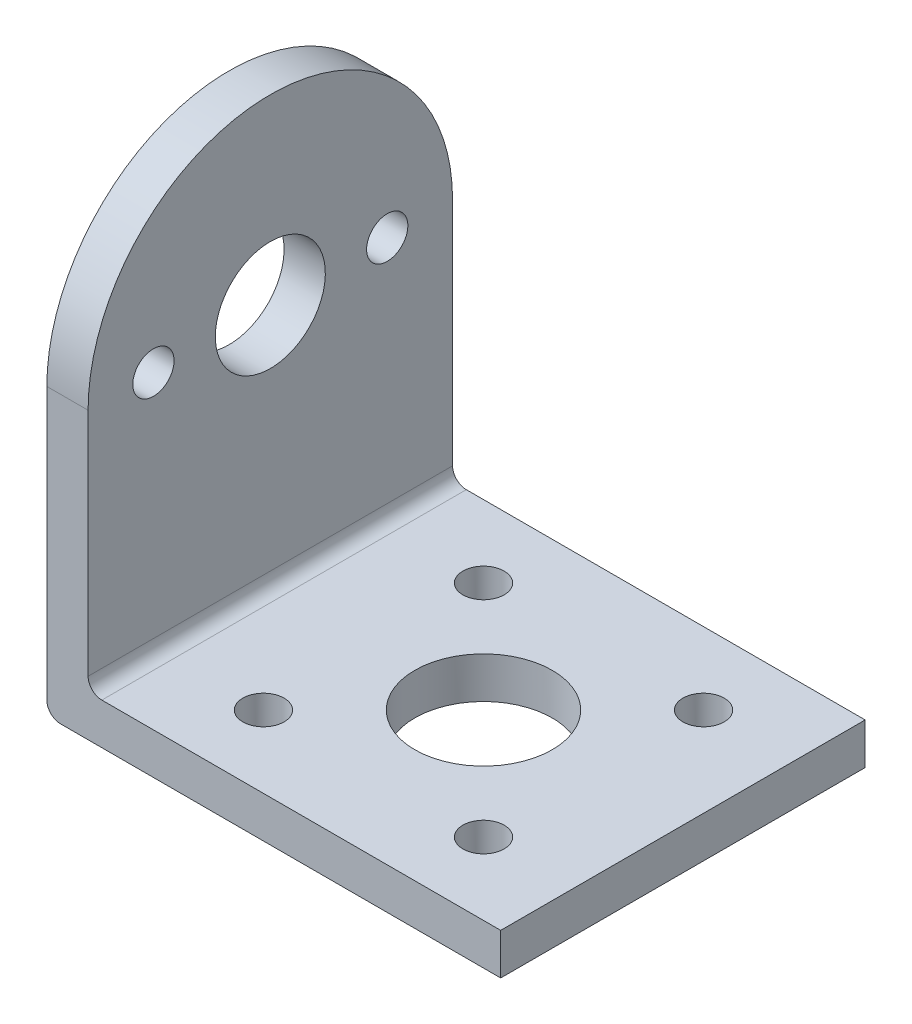
ISO-10303-21;
HEADER;
FILE_DESCRIPTION(('STEP AP214'),'2;1');
FILE_NAME('part.step','',(''),(''),'','','');
FILE_SCHEMA(('AUTOMOTIVE_DESIGN { 1 0 10303 214 1 1 1 1 }'));
ENDSEC;
DATA;
#1=APPLICATION_CONTEXT('core data for automotive mechanical design processes');
#2=APPLICATION_PROTOCOL_DEFINITION('international standard','automotive_design',2000,#1);
#3=PRODUCT_CONTEXT('',#1,'mechanical');
#4=PRODUCT('Part','Part','',(#3));
#5=PRODUCT_RELATED_PRODUCT_CATEGORY('part','',(#4));
#6=PRODUCT_DEFINITION_FORMATION('','',#4);
#7=PRODUCT_DEFINITION_CONTEXT('part definition',#1,'design');
#8=PRODUCT_DEFINITION('design','',#6,#7);
#9=PRODUCT_DEFINITION_SHAPE('','',#8);
#10=(LENGTH_UNIT() NAMED_UNIT(*) SI_UNIT(.MILLI.,.METRE.));
#11=(NAMED_UNIT(*) PLANE_ANGLE_UNIT() SI_UNIT($,.RADIAN.));
#12=(NAMED_UNIT(*) SI_UNIT($,.STERADIAN.) SOLID_ANGLE_UNIT());
#13=UNCERTAINTY_MEASURE_WITH_UNIT(LENGTH_MEASURE(1.E-05),#10,'distance_accuracy_value','');
#14=(GEOMETRIC_REPRESENTATION_CONTEXT(3) GLOBAL_UNCERTAINTY_ASSIGNED_CONTEXT((#13)) GLOBAL_UNIT_ASSIGNED_CONTEXT((#10,
#11,#12)) REPRESENTATION_CONTEXT('',''));
#15=CARTESIAN_POINT('',(0.,0.,0.));
#16=DIRECTION('',(0.,0.,1.));
#17=DIRECTION('',(1.,0.,0.));
#18=AXIS2_PLACEMENT_3D('',#15,#16,#17);
#19=CARTESIAN_POINT('',(33.,0.,26.5));
#20=DIRECTION('',(0.,1.,0.));
#21=DIRECTION('',(-1.,0.,0.));
#22=AXIS2_PLACEMENT_3D('',#19,#20,#21);
#23=PLANE('',#22);
#24=CARTESIAN_POINT('',(18.5,0.,13.25));
#25=DIRECTION('',(0.,1.,0.));
#26=DIRECTION('',(0.,0.,1.));
#27=AXIS2_PLACEMENT_3D('',#24,#25,#26);
#28=CIRCLE('',#27,5.);
#29=CARTESIAN_POINT('',(18.5,0.,18.25));
#30=VERTEX_POINT('',#29);
#31=EDGE_CURVE('E343',#30,#30,#28,.T.);
#32=ORIENTED_EDGE('',*,*,#31,.T.);
#33=EDGE_LOOP('',(#32));
#34=FACE_BOUND('',#33,.T.);
#35=CARTESIAN_POINT('',(26.5,0.,5.25));
#36=DIRECTION('',(0.,1.,0.));
#37=DIRECTION('',(0.,0.,1.));
#38=AXIS2_PLACEMENT_3D('',#35,#36,#37);
#39=CIRCLE('',#38,1.5);
#40=CARTESIAN_POINT('',(26.5,0.,6.75));
#41=VERTEX_POINT('',#40);
#42=EDGE_CURVE('E339',#41,#41,#39,.T.);
#43=ORIENTED_EDGE('',*,*,#42,.T.);
#44=EDGE_LOOP('',(#43));
#45=FACE_BOUND('',#44,.T.);
#46=CARTESIAN_POINT('',(10.5,0.,21.25));
#47=DIRECTION('',(0.,1.,0.));
#48=DIRECTION('',(0.,0.,1.));
#49=AXIS2_PLACEMENT_3D('',#46,#47,#48);
#50=CIRCLE('',#49,1.5);
#51=CARTESIAN_POINT('',(10.5,0.,22.75));
#52=VERTEX_POINT('',#51);
#53=EDGE_CURVE('E190',#52,#52,#50,.T.);
#54=ORIENTED_EDGE('',*,*,#53,.T.);
#55=EDGE_LOOP('',(#54));
#56=FACE_BOUND('',#55,.T.);
#57=DIRECTION('',(1.,0.,0.));
#58=VECTOR('',#57,1.);
#59=CARTESIAN_POINT('',(33.,0.,0.));
#60=LINE('',#59,#58);
#61=CARTESIAN_POINT('',(1.00000000000001,0.,0.));
#62=VERTEX_POINT('',#61);
#63=CARTESIAN_POINT('',(33.,0.,0.));
#64=VERTEX_POINT('',#63);
#65=EDGE_CURVE('E172',#62,#64,#60,.T.);
#66=ORIENTED_EDGE('',*,*,#65,.T.);
#67=DIRECTION('',(0.,0.,-1.));
#68=VECTOR('',#67,1.);
#69=CARTESIAN_POINT('',(33.,0.,26.5));
#70=LINE('',#69,#68);
#71=CARTESIAN_POINT('',(33.,0.,26.5));
#72=VERTEX_POINT('',#71);
#73=EDGE_CURVE('E155',#72,#64,#70,.T.);
#74=ORIENTED_EDGE('',*,*,#73,.F.);
#75=DIRECTION('',(1.,0.,0.));
#76=VECTOR('',#75,1.);
#77=CARTESIAN_POINT('',(33.,0.,26.5));
#78=LINE('',#77,#76);
#79=CARTESIAN_POINT('',(1.00000000000001,0.,26.5));
#80=VERTEX_POINT('',#79);
#81=EDGE_CURVE('E143',#80,#72,#78,.T.);
#82=ORIENTED_EDGE('',*,*,#81,.F.);
#83=DIRECTION('',(0.,0.,-1.));
#84=VECTOR('',#83,1.);
#85=CARTESIAN_POINT('',(1.00000000000001,0.,26.5));
#86=LINE('',#85,#84);
#87=EDGE_CURVE('E75',#80,#62,#86,.T.);
#88=ORIENTED_EDGE('',*,*,#87,.T.);
#89=EDGE_LOOP('',(#66,#74,#82,#88));
#90=FACE_BOUND('',#89,.T.);
#91=CARTESIAN_POINT('',(10.5,0.,5.25));
#92=DIRECTION('',(0.,1.,0.));
#93=DIRECTION('',(0.,0.,1.));
#94=AXIS2_PLACEMENT_3D('',#91,#92,#93);
#95=CIRCLE('',#94,1.5);
#96=CARTESIAN_POINT('',(10.5,0.,6.75));
#97=VERTEX_POINT('',#96);
#98=EDGE_CURVE('E336',#97,#97,#95,.F.);
#99=ORIENTED_EDGE('',*,*,#98,.F.);
#100=EDGE_LOOP('',(#99));
#101=FACE_BOUND('',#100,.T.);
#102=CARTESIAN_POINT('',(26.5,0.,21.25));
#103=DIRECTION('',(0.,1.,0.));
#104=DIRECTION('',(0.,0.,1.));
#105=AXIS2_PLACEMENT_3D('',#102,#103,#104);
#106=CIRCLE('',#105,1.5);
#107=CARTESIAN_POINT('',(26.5,0.,22.75));
#108=VERTEX_POINT('',#107);
#109=EDGE_CURVE('E347',#108,#108,#106,.F.);
#110=ORIENTED_EDGE('',*,*,#109,.F.);
#111=EDGE_LOOP('',(#110));
#112=FACE_BOUND('',#111,.T.);
#113=ADVANCED_FACE('F66',(#34,#45,#56,#90,#101,#112),#23,.F.);
#114=CARTESIAN_POINT('',(4.00000000000001,3.,26.5));
#115=DIRECTION('',(0.,-1.,0.));
#116=DIRECTION('',(0.,0.,-1.));
#117=AXIS2_PLACEMENT_3D('',#114,#115,#116);
#118=PLANE('',#117);
#119=CARTESIAN_POINT('',(18.5,3.,13.25));
#120=DIRECTION('',(0.,-1.,0.));
#121=DIRECTION('',(0.,0.,-1.));
#122=AXIS2_PLACEMENT_3D('',#119,#120,#121);
#123=CIRCLE('',#122,5.);
#124=CARTESIAN_POINT('',(18.5,3.,8.25));
#125=VERTEX_POINT('',#124);
#126=EDGE_CURVE('E195',#125,#125,#123,.T.);
#127=ORIENTED_EDGE('',*,*,#126,.T.);
#128=EDGE_LOOP('',(#127));
#129=FACE_BOUND('',#128,.T.);
#130=CARTESIAN_POINT('',(26.5,3.,5.25));
#131=DIRECTION('',(0.,-1.,0.));
#132=DIRECTION('',(0.,0.,-1.));
#133=AXIS2_PLACEMENT_3D('',#130,#131,#132);
#134=CIRCLE('',#133,1.5);
#135=CARTESIAN_POINT('',(26.5,3.,3.75));
#136=VERTEX_POINT('',#135);
#137=EDGE_CURVE('E193',#136,#136,#134,.T.);
#138=ORIENTED_EDGE('',*,*,#137,.T.);
#139=EDGE_LOOP('',(#138));
#140=FACE_BOUND('',#139,.T.);
#141=CARTESIAN_POINT('',(10.5,3.,21.25));
#142=DIRECTION('',(0.,-1.,0.));
#143=DIRECTION('',(0.,0.,-1.));
#144=AXIS2_PLACEMENT_3D('',#141,#142,#143);
#145=CIRCLE('',#144,1.5);
#146=CARTESIAN_POINT('',(10.5,3.,19.75));
#147=VERTEX_POINT('',#146);
#148=EDGE_CURVE('E186',#147,#147,#145,.T.);
#149=ORIENTED_EDGE('',*,*,#148,.T.);
#150=EDGE_LOOP('',(#149));
#151=FACE_BOUND('',#150,.T.);
#152=DIRECTION('',(-1.,0.,0.));
#153=VECTOR('',#152,1.);
#154=CARTESIAN_POINT('',(4.00000000000001,3.,0.));
#155=LINE('',#154,#153);
#156=CARTESIAN_POINT('',(33.,3.,0.));
#157=VERTEX_POINT('',#156);
#158=CARTESIAN_POINT('',(4.00000000000001,3.,0.));
#159=VERTEX_POINT('',#158);
#160=EDGE_CURVE('E175',#157,#159,#155,.T.);
#161=ORIENTED_EDGE('',*,*,#160,.T.);
#162=DIRECTION('',(0.,0.,-1.));
#163=VECTOR('',#162,1.);
#164=CARTESIAN_POINT('',(4.00000000000001,3.,26.5));
#165=LINE('',#164,#163);
#166=CARTESIAN_POINT('',(4.00000000000001,3.,26.5));
#167=VERTEX_POINT('',#166);
#168=EDGE_CURVE('E156',#167,#159,#165,.T.);
#169=ORIENTED_EDGE('',*,*,#168,.F.);
#170=DIRECTION('',(-1.,0.,0.));
#171=VECTOR('',#170,1.);
#172=CARTESIAN_POINT('',(4.00000000000001,3.,26.5));
#173=LINE('',#172,#171);
#174=CARTESIAN_POINT('',(33.,3.,26.5));
#175=VERTEX_POINT('',#174);
#176=EDGE_CURVE('E140',#175,#167,#173,.T.);
#177=ORIENTED_EDGE('',*,*,#176,.F.);
#178=DIRECTION('',(0.,0.,-1.));
#179=VECTOR('',#178,1.);
#180=CARTESIAN_POINT('',(33.,3.,26.5));
#181=LINE('',#180,#179);
#182=EDGE_CURVE('E149',#175,#157,#181,.T.);
#183=ORIENTED_EDGE('',*,*,#182,.T.);
#184=EDGE_LOOP('',(#161,#169,#177,#183));
#185=FACE_BOUND('',#184,.T.);
#186=CARTESIAN_POINT('',(10.5,3.,5.25));
#187=DIRECTION('',(0.,-1.,0.));
#188=DIRECTION('',(0.,0.,-1.));
#189=AXIS2_PLACEMENT_3D('',#186,#187,#188);
#190=CIRCLE('',#189,1.5);
#191=CARTESIAN_POINT('',(10.5,3.,3.75));
#192=VERTEX_POINT('',#191);
#193=EDGE_CURVE('E189',#192,#192,#190,.F.);
#194=ORIENTED_EDGE('',*,*,#193,.F.);
#195=EDGE_LOOP('',(#194));
#196=FACE_BOUND('',#195,.T.);
#197=CARTESIAN_POINT('',(26.5,3.,21.25));
#198=DIRECTION('',(0.,-1.,0.));
#199=DIRECTION('',(0.,0.,-1.));
#200=AXIS2_PLACEMENT_3D('',#197,#198,#199);
#201=CIRCLE('',#200,1.5);
#202=CARTESIAN_POINT('',(26.5,3.,19.75));
#203=VERTEX_POINT('',#202);
#204=EDGE_CURVE('E70',#203,#203,#201,.F.);
#205=ORIENTED_EDGE('',*,*,#204,.F.);
#206=EDGE_LOOP('',(#205));
#207=FACE_BOUND('',#206,.T.);
#208=ADVANCED_FACE('F158',(#129,#140,#151,#185,#196,#207),#118,.F.);
#209=CARTESIAN_POINT('',(0.,1.00000000000001,26.5));
#210=DIRECTION('',(1.,0.,0.));
#211=DIRECTION('',(0.,0.,-1.));
#212=AXIS2_PLACEMENT_3D('',#209,#210,#211);
#213=PLANE('',#212);
#214=CARTESIAN_POINT('',(0.,20.75,13.25));
#215=DIRECTION('',(1.,0.,0.));
#216=DIRECTION('',(0.,1.,0.));
#217=AXIS2_PLACEMENT_3D('',#214,#215,#216);
#218=CIRCLE('',#217,4.);
#219=CARTESIAN_POINT('',(0.,24.75,13.25));
#220=VERTEX_POINT('',#219);
#221=EDGE_CURVE('E204',#220,#220,#218,.T.);
#222=ORIENTED_EDGE('',*,*,#221,.T.);
#223=EDGE_LOOP('',(#222));
#224=FACE_BOUND('',#223,.T.);
#225=CARTESIAN_POINT('',(0.,20.75,13.25));
#226=DIRECTION('',(1.,0.,0.));
#227=DIRECTION('',(0.,1.,0.));
#228=AXIS2_PLACEMENT_3D('',#225,#226,#227);
#229=CIRCLE('',#228,13.25);
#230=CARTESIAN_POINT('',(0.,20.75,26.5));
#231=VERTEX_POINT('',#230);
#232=CARTESIAN_POINT('',(0.,20.75,0.));
#233=VERTEX_POINT('',#232);
#234=EDGE_CURVE('E83',#231,#233,#229,.F.);
#235=ORIENTED_EDGE('',*,*,#234,.T.);
#236=DIRECTION('',(0.,-1.,0.));
#237=VECTOR('',#236,1.);
#238=CARTESIAN_POINT('',(0.,1.00000000000001,0.));
#239=LINE('',#238,#237);
#240=CARTESIAN_POINT('',(0.,1.00000000000001,0.));
#241=VERTEX_POINT('',#240);
#242=EDGE_CURVE('E167',#233,#241,#239,.T.);
#243=ORIENTED_EDGE('',*,*,#242,.T.);
#244=DIRECTION('',(0.,0.,-1.));
#245=VECTOR('',#244,1.);
#246=CARTESIAN_POINT('',(0.,1.00000000000001,26.5));
#247=LINE('',#246,#245);
#248=CARTESIAN_POINT('',(0.,1.00000000000001,26.5));
#249=VERTEX_POINT('',#248);
#250=EDGE_CURVE('E12',#249,#241,#247,.T.);
#251=ORIENTED_EDGE('',*,*,#250,.F.);
#252=DIRECTION('',(0.,-1.,0.));
#253=VECTOR('',#252,1.);
#254=CARTESIAN_POINT('',(0.,1.00000000000001,26.5));
#255=LINE('',#254,#253);
#256=EDGE_CURVE('E126',#231,#249,#255,.T.);
#257=ORIENTED_EDGE('',*,*,#256,.F.);
#258=EDGE_LOOP('',(#235,#243,#251,#257));
#259=FACE_BOUND('',#258,.T.);
#260=CARTESIAN_POINT('',(0.,20.75,21.75));
#261=DIRECTION('',(-1.,0.,0.));
#262=DIRECTION('',(0.,-1.,0.));
#263=AXIS2_PLACEMENT_3D('',#260,#261,#262);
#264=CIRCLE('',#263,1.5);
#265=CARTESIAN_POINT('',(0.,22.25,21.75));
#266=VERTEX_POINT('',#265);
#267=EDGE_CURVE('E209',#266,#266,#264,.T.);
#268=ORIENTED_EDGE('',*,*,#267,.F.);
#269=EDGE_LOOP('',(#268));
#270=FACE_BOUND('',#269,.T.);
#271=CARTESIAN_POINT('',(0.,20.75,4.75));
#272=DIRECTION('',(1.,0.,0.));
#273=DIRECTION('',(0.,1.,0.));
#274=AXIS2_PLACEMENT_3D('',#271,#272,#273);
#275=CIRCLE('',#274,1.5);
#276=CARTESIAN_POINT('',(0.,22.25,4.75));
#277=VERTEX_POINT('',#276);
#278=EDGE_CURVE('E217',#277,#277,#275,.T.);
#279=ORIENTED_EDGE('',*,*,#278,.T.);
#280=EDGE_LOOP('',(#279));
#281=FACE_BOUND('',#280,.T.);
#282=ADVANCED_FACE('F68',(#224,#259,#270,#281),#213,.F.);
#283=CARTESIAN_POINT('',(3.,34.,26.5));
#284=DIRECTION('',(-1.,0.,0.));
#285=DIRECTION('',(0.,-1.,0.));
#286=AXIS2_PLACEMENT_3D('',#283,#284,#285);
#287=PLANE('',#286);
#288=CARTESIAN_POINT('',(3.,20.75,13.25));
#289=DIRECTION('',(1.,0.,0.));
#290=DIRECTION('',(0.,1.,0.));
#291=AXIS2_PLACEMENT_3D('',#288,#289,#290);
#292=CIRCLE('',#291,4.);
#293=CARTESIAN_POINT('',(3.,24.75,13.25));
#294=VERTEX_POINT('',#293);
#295=EDGE_CURVE('E200',#294,#294,#292,.T.);
#296=ORIENTED_EDGE('',*,*,#295,.F.);
#297=EDGE_LOOP('',(#296));
#298=FACE_BOUND('',#297,.T.);
#299=DIRECTION('',(0.,1.,0.));
#300=VECTOR('',#299,1.);
#301=CARTESIAN_POINT('',(3.,34.,0.));
#302=LINE('',#301,#300);
#303=CARTESIAN_POINT('',(3.,4.00000000000001,0.));
#304=VERTEX_POINT('',#303);
#305=CARTESIAN_POINT('',(3.,20.75,0.));
#306=VERTEX_POINT('',#305);
#307=EDGE_CURVE('E178',#304,#306,#302,.T.);
#308=ORIENTED_EDGE('',*,*,#307,.T.);
#309=CARTESIAN_POINT('',(3.,20.75,13.25));
#310=DIRECTION('',(1.,0.,0.));
#311=DIRECTION('',(0.,1.,0.));
#312=AXIS2_PLACEMENT_3D('',#309,#310,#311);
#313=CIRCLE('',#312,13.25);
#314=CARTESIAN_POINT('',(3.,20.75,26.5));
#315=VERTEX_POINT('',#314);
#316=EDGE_CURVE('E223',#315,#306,#313,.F.);
#317=ORIENTED_EDGE('',*,*,#316,.F.);
#318=DIRECTION('',(0.,1.,0.));
#319=VECTOR('',#318,1.);
#320=CARTESIAN_POINT('',(3.,34.,26.5));
#321=LINE('',#320,#319);
#322=CARTESIAN_POINT('',(3.,4.00000000000001,26.5));
#323=VERTEX_POINT('',#322);
#324=EDGE_CURVE('E161',#323,#315,#321,.T.);
#325=ORIENTED_EDGE('',*,*,#324,.F.);
#326=DIRECTION('',(0.,0.,-1.));
#327=VECTOR('',#326,1.);
#328=CARTESIAN_POINT('',(3.,4.00000000000001,26.5));
#329=LINE('',#328,#327);
#330=EDGE_CURVE('E166',#323,#304,#329,.T.);
#331=ORIENTED_EDGE('',*,*,#330,.T.);
#332=EDGE_LOOP('',(#308,#317,#325,#331));
#333=FACE_BOUND('',#332,.T.);
#334=CARTESIAN_POINT('',(3.,20.75,21.75));
#335=DIRECTION('',(-1.,0.,0.));
#336=DIRECTION('',(0.,-1.,0.));
#337=AXIS2_PLACEMENT_3D('',#334,#335,#336);
#338=CIRCLE('',#337,1.5);
#339=CARTESIAN_POINT('',(3.,22.25,21.75));
#340=VERTEX_POINT('',#339);
#341=EDGE_CURVE('E220',#340,#340,#338,.T.);
#342=ORIENTED_EDGE('',*,*,#341,.T.);
#343=EDGE_LOOP('',(#342));
#344=FACE_BOUND('',#343,.T.);
#345=CARTESIAN_POINT('',(3.,20.75,4.75));
#346=DIRECTION('',(1.,0.,0.));
#347=DIRECTION('',(0.,1.,0.));
#348=AXIS2_PLACEMENT_3D('',#345,#346,#347);
#349=CIRCLE('',#348,1.5);
#350=CARTESIAN_POINT('',(3.,22.25,4.75));
#351=VERTEX_POINT('',#350);
#352=EDGE_CURVE('E213',#351,#351,#349,.T.);
#353=ORIENTED_EDGE('',*,*,#352,.F.);
#354=EDGE_LOOP('',(#353));
#355=FACE_BOUND('',#354,.T.);
#356=ADVANCED_FACE('F249',(#298,#333,#344,#355),#287,.F.);
#357=CARTESIAN_POINT('',(4.,4.,0.));
#358=DIRECTION('',(0.,0.,1.));
#359=DIRECTION('',(1.,0.,0.));
#360=AXIS2_PLACEMENT_3D('',#357,#358,#359);
#361=PLANE('',#360);
#362=DIRECTION('',(1.,0.,0.));
#363=VECTOR('',#362,1.);
#364=CARTESIAN_POINT('',(0.,20.75,0.));
#365=LINE('',#364,#363);
#366=EDGE_CURVE('E216',#233,#306,#365,.T.);
#367=ORIENTED_EDGE('',*,*,#366,.T.);
#368=ORIENTED_EDGE('',*,*,#307,.F.);
#369=CARTESIAN_POINT('',(4.,4.,0.));
#370=DIRECTION('',(0.,0.,-1.));
#371=DIRECTION('',(1.,0.,0.));
#372=AXIS2_PLACEMENT_3D('',#369,#370,#371);
#373=CIRCLE('',#372,1.);
#374=EDGE_CURVE('E119',#159,#304,#373,.T.);
#375=ORIENTED_EDGE('',*,*,#374,.F.);
#376=ORIENTED_EDGE('',*,*,#160,.F.);
#377=DIRECTION('',(0.,1.,0.));
#378=VECTOR('',#377,1.);
#379=CARTESIAN_POINT('',(33.,3.,0.));
#380=LINE('',#379,#378);
#381=EDGE_CURVE('E152',#64,#157,#380,.T.);
#382=ORIENTED_EDGE('',*,*,#381,.F.);
#383=ORIENTED_EDGE('',*,*,#65,.F.);
#384=CARTESIAN_POINT('',(1.,1.,0.));
#385=DIRECTION('',(0.,0.,1.));
#386=DIRECTION('',(1.,0.,0.));
#387=AXIS2_PLACEMENT_3D('',#384,#385,#386);
#388=CIRCLE('',#387,1.);
#389=EDGE_CURVE('E169',#241,#62,#388,.T.);
#390=ORIENTED_EDGE('',*,*,#389,.F.);
#391=ORIENTED_EDGE('',*,*,#242,.F.);
#392=EDGE_LOOP('',(#367,#368,#375,#376,#382,#383,#390,#391));
#393=FACE_BOUND('',#392,.T.);
#394=ADVANCED_FACE('F243',(#393),#361,.F.);
#395=CARTESIAN_POINT('',(4.,4.,26.5));
#396=DIRECTION('',(0.,0.,1.));
#397=DIRECTION('',(1.,0.,0.));
#398=AXIS2_PLACEMENT_3D('',#395,#396,#397);
#399=PLANE('',#398);
#400=ORIENTED_EDGE('',*,*,#324,.T.);
#401=DIRECTION('',(1.,0.,0.));
#402=VECTOR('',#401,1.);
#403=CARTESIAN_POINT('',(0.,20.75,26.5));
#404=LINE('',#403,#402);
#405=EDGE_CURVE('E170',#231,#315,#404,.T.);
#406=ORIENTED_EDGE('',*,*,#405,.F.);
#407=ORIENTED_EDGE('',*,*,#256,.T.);
#408=CARTESIAN_POINT('',(1.,1.,26.5));
#409=DIRECTION('',(0.,0.,1.));
#410=DIRECTION('',(1.,0.,0.));
#411=AXIS2_PLACEMENT_3D('',#408,#409,#410);
#412=CIRCLE('',#411,1.);
#413=EDGE_CURVE('E233',#249,#80,#412,.T.);
#414=ORIENTED_EDGE('',*,*,#413,.T.);
#415=ORIENTED_EDGE('',*,*,#81,.T.);
#416=DIRECTION('',(0.,1.,0.));
#417=VECTOR('',#416,1.);
#418=CARTESIAN_POINT('',(33.,3.,26.5));
#419=LINE('',#418,#417);
#420=EDGE_CURVE('E136',#72,#175,#419,.T.);
#421=ORIENTED_EDGE('',*,*,#420,.T.);
#422=ORIENTED_EDGE('',*,*,#176,.T.);
#423=CARTESIAN_POINT('',(4.,4.,26.5));
#424=DIRECTION('',(0.,0.,-1.));
#425=DIRECTION('',(1.,0.,0.));
#426=AXIS2_PLACEMENT_3D('',#423,#424,#425);
#427=CIRCLE('',#426,1.);
#428=EDGE_CURVE('E92',#167,#323,#427,.T.);
#429=ORIENTED_EDGE('',*,*,#428,.T.);
#430=EDGE_LOOP('',(#400,#406,#407,#414,#415,#421,#422,#429));
#431=FACE_BOUND('',#430,.T.);
#432=ADVANCED_FACE('F138',(#431),#399,.T.);
#433=CARTESIAN_POINT('',(1.,1.,26.5));
#434=DIRECTION('',(0.,0.,-1.));
#435=DIRECTION('',(-1.,0.,0.));
#436=AXIS2_PLACEMENT_3D('',#433,#434,#435);
#437=CYLINDRICAL_SURFACE('',#436,1.);
#438=ORIENTED_EDGE('',*,*,#389,.T.);
#439=ORIENTED_EDGE('',*,*,#87,.F.);
#440=ORIENTED_EDGE('',*,*,#413,.F.);
#441=ORIENTED_EDGE('',*,*,#250,.T.);
#442=EDGE_LOOP('',(#438,#439,#440,#441));
#443=FACE_BOUND('',#442,.T.);
#444=ADVANCED_FACE('F237',(#443),#437,.T.);
#445=CARTESIAN_POINT('',(33.,3.,26.5));
#446=DIRECTION('',(-1.,0.,0.));
#447=DIRECTION('',(0.,0.,1.));
#448=AXIS2_PLACEMENT_3D('',#445,#446,#447);
#449=PLANE('',#448);
#450=ORIENTED_EDGE('',*,*,#381,.T.);
#451=ORIENTED_EDGE('',*,*,#182,.F.);
#452=ORIENTED_EDGE('',*,*,#420,.F.);
#453=ORIENTED_EDGE('',*,*,#73,.T.);
#454=EDGE_LOOP('',(#450,#451,#452,#453));
#455=FACE_BOUND('',#454,.T.);
#456=ADVANCED_FACE('F150',(#455),#449,.F.);
#457=CARTESIAN_POINT('',(4.,4.,26.5));
#458=DIRECTION('',(0.,0.,-1.));
#459=DIRECTION('',(-1.,0.,0.));
#460=AXIS2_PLACEMENT_3D('',#457,#458,#459);
#461=CYLINDRICAL_SURFACE('',#460,1.);
#462=ORIENTED_EDGE('',*,*,#374,.T.);
#463=ORIENTED_EDGE('',*,*,#330,.F.);
#464=ORIENTED_EDGE('',*,*,#428,.F.);
#465=ORIENTED_EDGE('',*,*,#168,.T.);
#466=EDGE_LOOP('',(#462,#463,#464,#465));
#467=FACE_BOUND('',#466,.T.);
#468=ADVANCED_FACE('F245',(#467),#461,.F.);
#469=CARTESIAN_POINT('',(0.,20.75,13.25));
#470=DIRECTION('',(1.,0.,0.));
#471=DIRECTION('',(0.,1.,0.));
#472=AXIS2_PLACEMENT_3D('',#469,#470,#471);
#473=CYLINDRICAL_SURFACE('',#472,13.25);
#474=ORIENTED_EDGE('',*,*,#316,.T.);
#475=ORIENTED_EDGE('',*,*,#366,.F.);
#476=ORIENTED_EDGE('',*,*,#234,.F.);
#477=ORIENTED_EDGE('',*,*,#405,.T.);
#478=EDGE_LOOP('',(#474,#475,#476,#477));
#479=FACE_BOUND('',#478,.T.);
#480=ADVANCED_FACE('F257',(#479),#473,.T.);
#481=CARTESIAN_POINT('',(0.,20.75,21.75));
#482=DIRECTION('',(1.,0.,0.));
#483=DIRECTION('',(0.,1.,0.));
#484=AXIS2_PLACEMENT_3D('',#481,#482,#483);
#485=CYLINDRICAL_SURFACE('',#484,1.5);
#486=CARTESIAN_POINT('',(0.,22.25,21.75));
#487=CARTESIAN_POINT('',(0.0312499999999968,22.25,21.75));
#488=CARTESIAN_POINT('',(0.0624999999999969,22.25,21.75));
#489=CARTESIAN_POINT('',(0.124999999999997,22.25,21.75));
#490=CARTESIAN_POINT('',(0.156249999999997,22.25,21.75));
#491=CARTESIAN_POINT('',(0.218749999999997,22.25,21.75));
#492=CARTESIAN_POINT('',(0.249999999999997,22.25,21.75));
#493=CARTESIAN_POINT('',(0.312499999999997,22.25,21.75));
#494=CARTESIAN_POINT('',(0.343749999999997,22.25,21.75));
#495=CARTESIAN_POINT('',(0.406249999999997,22.25,21.75));
#496=CARTESIAN_POINT('',(0.437499999999997,22.25,21.75));
#497=CARTESIAN_POINT('',(0.499999999999997,22.25,21.75));
#498=CARTESIAN_POINT('',(0.531249999999997,22.25,21.75));
#499=CARTESIAN_POINT('',(0.593749999999997,22.25,21.75));
#500=CARTESIAN_POINT('',(0.624999999999997,22.25,21.75));
#501=CARTESIAN_POINT('',(0.687499999999997,22.25,21.75));
#502=CARTESIAN_POINT('',(0.718749999999997,22.25,21.75));
#503=CARTESIAN_POINT('',(0.781249999999998,22.25,21.75));
#504=CARTESIAN_POINT('',(0.812499999999998,22.25,21.75));
#505=CARTESIAN_POINT('',(0.874999999999998,22.25,21.75));
#506=CARTESIAN_POINT('',(0.906249999999998,22.25,21.75));
#507=CARTESIAN_POINT('',(0.968749999999998,22.25,21.75));
#508=CARTESIAN_POINT('',(0.999999999999998,22.25,21.75));
#509=CARTESIAN_POINT('',(1.0625,22.25,21.75));
#510=CARTESIAN_POINT('',(1.09375,22.25,21.75));
#511=CARTESIAN_POINT('',(1.15625,22.25,21.75));
#512=CARTESIAN_POINT('',(1.1875,22.25,21.75));
#513=CARTESIAN_POINT('',(1.25,22.25,21.75));
#514=CARTESIAN_POINT('',(1.28125,22.25,21.75));
#515=CARTESIAN_POINT('',(1.34375,22.25,21.75));
#516=CARTESIAN_POINT('',(1.375,22.25,21.75));
#517=CARTESIAN_POINT('',(1.4375,22.25,21.75));
#518=CARTESIAN_POINT('',(1.46875,22.25,21.75));
#519=CARTESIAN_POINT('',(1.53125,22.25,21.75));
#520=CARTESIAN_POINT('',(1.5625,22.25,21.75));
#521=CARTESIAN_POINT('',(1.625,22.25,21.75));
#522=CARTESIAN_POINT('',(1.65625,22.25,21.75));
#523=CARTESIAN_POINT('',(1.71875,22.25,21.75));
#524=CARTESIAN_POINT('',(1.75,22.25,21.75));
#525=CARTESIAN_POINT('',(1.8125,22.25,21.75));
#526=CARTESIAN_POINT('',(1.84375,22.25,21.75));
#527=CARTESIAN_POINT('',(1.90625,22.25,21.75));
#528=CARTESIAN_POINT('',(1.9375,22.25,21.75));
#529=CARTESIAN_POINT('',(2.,22.25,21.75));
#530=CARTESIAN_POINT('',(2.03125,22.25,21.75));
#531=CARTESIAN_POINT('',(2.09375,22.25,21.75));
#532=CARTESIAN_POINT('',(2.125,22.25,21.75));
#533=CARTESIAN_POINT('',(2.1875,22.25,21.75));
#534=CARTESIAN_POINT('',(2.21875,22.25,21.75));
#535=CARTESIAN_POINT('',(2.28125,22.25,21.75));
#536=CARTESIAN_POINT('',(2.3125,22.25,21.75));
#537=CARTESIAN_POINT('',(2.375,22.25,21.75));
#538=CARTESIAN_POINT('',(2.40625,22.25,21.75));
#539=CARTESIAN_POINT('',(2.46875,22.25,21.75));
#540=CARTESIAN_POINT('',(2.5,22.25,21.75));
#541=CARTESIAN_POINT('',(2.5625,22.25,21.75));
#542=CARTESIAN_POINT('',(2.59375,22.25,21.75));
#543=CARTESIAN_POINT('',(2.65625,22.25,21.75));
#544=CARTESIAN_POINT('',(2.6875,22.25,21.75));
#545=CARTESIAN_POINT('',(2.75,22.25,21.75));
#546=CARTESIAN_POINT('',(2.78125,22.25,21.75));
#547=CARTESIAN_POINT('',(2.84375,22.25,21.75));
#548=CARTESIAN_POINT('',(2.875,22.25,21.75));
#549=CARTESIAN_POINT('',(2.9375,22.25,21.75));
#550=CARTESIAN_POINT('',(2.96875,22.25,21.75));
#551=CARTESIAN_POINT('',(3.,22.25,21.75));
#552=B_SPLINE_CURVE_WITH_KNOTS('',3,(#486,#487,#488,#489,#490,#491,#492,#493,#494,#495,#496,
#497,#498,#499,#500,#501,#502,#503,#504,#505,#506,#507,#508,#509,#510,#511,#512,#513,#514,#515,
#516,#517,#518,#519,#520,#521,#522,#523,#524,#525,#526,#527,#528,#529,#530,#531,#532,#533,#534,
#535,#536,#537,#538,#539,#540,#541,#542,#543,#544,#545,#546,#547,#548,#549,#550,#551),
.UNSPECIFIED.,.F.,.F.,(4,2,2,2,2,2,2,2,2,2,2,2,2,2,2,2,2,2,2,2,2,2,2,2,2,2,2,2,2,2,2,2,4),(0.,
0.0937500000000001,0.1875,0.28125,0.375,0.46875,0.562500000000001,0.656250000000001,
0.750000000000001,0.843750000000001,0.937500000000001,1.03125,1.125,1.21875,1.3125,1.40625,1.5,
1.59375,1.6875,1.78125,1.875,1.96875,2.0625,2.15625,2.25,2.34375,2.4375,2.53125,2.625,2.71875,
2.8125,2.90625,3.),.UNSPECIFIED.);
#553=EDGE_CURVE('BSEAM259',#266,#340,#552,.T.);
#554=ORIENTED_EDGE('',*,*,#267,.T.);
#555=ORIENTED_EDGE('',*,*,#341,.F.);
#556=ORIENTED_EDGE('',*,*,#553,.T.);
#557=ORIENTED_EDGE('',*,*,#553,.F.);
#558=EDGE_LOOP('',(#554,#556,#555,#557));
#559=FACE_BOUND('',#558,.T.);
#560=ADVANCED_FACE('F259',(#559),#485,.F.);
#561=CARTESIAN_POINT('',(0.,20.75,4.75));
#562=DIRECTION('',(1.,0.,0.));
#563=DIRECTION('',(0.,1.,0.));
#564=AXIS2_PLACEMENT_3D('',#561,#562,#563);
#565=CYLINDRICAL_SURFACE('',#564,1.5);
#566=CARTESIAN_POINT('',(0.,22.25,4.75));
#567=CARTESIAN_POINT('',(0.0312499999999968,22.25,4.75));
#568=CARTESIAN_POINT('',(0.0624999999999969,22.25,4.75));
#569=CARTESIAN_POINT('',(0.124999999999997,22.25,4.75));
#570=CARTESIAN_POINT('',(0.156249999999997,22.25,4.75));
#571=CARTESIAN_POINT('',(0.218749999999997,22.25,4.75));
#572=CARTESIAN_POINT('',(0.249999999999997,22.25,4.75));
#573=CARTESIAN_POINT('',(0.312499999999997,22.25,4.75));
#574=CARTESIAN_POINT('',(0.343749999999997,22.25,4.75));
#575=CARTESIAN_POINT('',(0.406249999999997,22.25,4.75));
#576=CARTESIAN_POINT('',(0.437499999999997,22.25,4.75));
#577=CARTESIAN_POINT('',(0.499999999999997,22.25,4.75));
#578=CARTESIAN_POINT('',(0.531249999999997,22.25,4.75));
#579=CARTESIAN_POINT('',(0.593749999999997,22.25,4.75));
#580=CARTESIAN_POINT('',(0.624999999999997,22.25,4.75));
#581=CARTESIAN_POINT('',(0.687499999999997,22.25,4.75));
#582=CARTESIAN_POINT('',(0.718749999999997,22.25,4.75));
#583=CARTESIAN_POINT('',(0.781249999999998,22.25,4.75));
#584=CARTESIAN_POINT('',(0.812499999999998,22.25,4.75));
#585=CARTESIAN_POINT('',(0.874999999999998,22.25,4.75));
#586=CARTESIAN_POINT('',(0.906249999999998,22.25,4.75));
#587=CARTESIAN_POINT('',(0.968749999999998,22.25,4.75));
#588=CARTESIAN_POINT('',(0.999999999999998,22.25,4.75));
#589=CARTESIAN_POINT('',(1.0625,22.25,4.75));
#590=CARTESIAN_POINT('',(1.09375,22.25,4.75));
#591=CARTESIAN_POINT('',(1.15625,22.25,4.75));
#592=CARTESIAN_POINT('',(1.1875,22.25,4.75));
#593=CARTESIAN_POINT('',(1.25,22.25,4.75));
#594=CARTESIAN_POINT('',(1.28125,22.25,4.75));
#595=CARTESIAN_POINT('',(1.34375,22.25,4.75));
#596=CARTESIAN_POINT('',(1.375,22.25,4.75));
#597=CARTESIAN_POINT('',(1.4375,22.25,4.75));
#598=CARTESIAN_POINT('',(1.46875,22.25,4.75));
#599=CARTESIAN_POINT('',(1.53125,22.25,4.75));
#600=CARTESIAN_POINT('',(1.5625,22.25,4.75));
#601=CARTESIAN_POINT('',(1.625,22.25,4.75));
#602=CARTESIAN_POINT('',(1.65625,22.25,4.75));
#603=CARTESIAN_POINT('',(1.71875,22.25,4.75));
#604=CARTESIAN_POINT('',(1.75,22.25,4.75));
#605=CARTESIAN_POINT('',(1.8125,22.25,4.75));
#606=CARTESIAN_POINT('',(1.84375,22.25,4.75));
#607=CARTESIAN_POINT('',(1.90625,22.25,4.75));
#608=CARTESIAN_POINT('',(1.9375,22.25,4.75));
#609=CARTESIAN_POINT('',(2.,22.25,4.75));
#610=CARTESIAN_POINT('',(2.03125,22.25,4.75));
#611=CARTESIAN_POINT('',(2.09375,22.25,4.75));
#612=CARTESIAN_POINT('',(2.125,22.25,4.75));
#613=CARTESIAN_POINT('',(2.1875,22.25,4.75));
#614=CARTESIAN_POINT('',(2.21875,22.25,4.75));
#615=CARTESIAN_POINT('',(2.28125,22.25,4.75));
#616=CARTESIAN_POINT('',(2.3125,22.25,4.75));
#617=CARTESIAN_POINT('',(2.375,22.25,4.75));
#618=CARTESIAN_POINT('',(2.40625,22.25,4.75));
#619=CARTESIAN_POINT('',(2.46875,22.25,4.75));
#620=CARTESIAN_POINT('',(2.5,22.25,4.75));
#621=CARTESIAN_POINT('',(2.5625,22.25,4.75));
#622=CARTESIAN_POINT('',(2.59375,22.25,4.75));
#623=CARTESIAN_POINT('',(2.65625,22.25,4.75));
#624=CARTESIAN_POINT('',(2.6875,22.25,4.75));
#625=CARTESIAN_POINT('',(2.75,22.25,4.75));
#626=CARTESIAN_POINT('',(2.78125,22.25,4.75));
#627=CARTESIAN_POINT('',(2.84375,22.25,4.75));
#628=CARTESIAN_POINT('',(2.875,22.25,4.75));
#629=CARTESIAN_POINT('',(2.9375,22.25,4.75));
#630=CARTESIAN_POINT('',(2.96875,22.25,4.75));
#631=CARTESIAN_POINT('',(3.,22.25,4.75));
#632=B_SPLINE_CURVE_WITH_KNOTS('',3,(#566,#567,#568,#569,#570,#571,#572,#573,#574,#575,#576,
#577,#578,#579,#580,#581,#582,#583,#584,#585,#586,#587,#588,#589,#590,#591,#592,#593,#594,#595,
#596,#597,#598,#599,#600,#601,#602,#603,#604,#605,#606,#607,#608,#609,#610,#611,#612,#613,#614,
#615,#616,#617,#618,#619,#620,#621,#622,#623,#624,#625,#626,#627,#628,#629,#630,#631),
.UNSPECIFIED.,.F.,.F.,(4,2,2,2,2,2,2,2,2,2,2,2,2,2,2,2,2,2,2,2,2,2,2,2,2,2,2,2,2,2,2,2,4),(0.,
0.0937500000000001,0.1875,0.28125,0.375,0.46875,0.562500000000001,0.656250000000001,
0.750000000000001,0.843750000000001,0.937500000000001,1.03125,1.125,1.21875,1.3125,1.40625,1.5,
1.59375,1.6875,1.78125,1.875,1.96875,2.0625,2.15625,2.25,2.34375,2.4375,2.53125,2.625,2.71875,
2.8125,2.90625,3.),.UNSPECIFIED.);
#633=EDGE_CURVE('BSEAM265',#277,#351,#632,.T.);
#634=ORIENTED_EDGE('',*,*,#278,.F.);
#635=ORIENTED_EDGE('',*,*,#352,.T.);
#636=ORIENTED_EDGE('',*,*,#633,.T.);
#637=ORIENTED_EDGE('',*,*,#633,.F.);
#638=EDGE_LOOP('',(#634,#636,#635,#637));
#639=FACE_BOUND('',#638,.T.);
#640=ADVANCED_FACE('F265',(#639),#565,.F.);
#641=CARTESIAN_POINT('',(0.,20.75,13.25));
#642=DIRECTION('',(1.,0.,0.));
#643=DIRECTION('',(0.,1.,0.));
#644=AXIS2_PLACEMENT_3D('',#641,#642,#643);
#645=CYLINDRICAL_SURFACE('',#644,4.);
#646=CARTESIAN_POINT('',(0.,24.75,13.25));
#647=CARTESIAN_POINT('',(0.0312499999999939,24.75,13.25));
#648=CARTESIAN_POINT('',(0.062499999999994,24.75,13.25));
#649=CARTESIAN_POINT('',(0.124999999999994,24.75,13.25));
#650=CARTESIAN_POINT('',(0.156249999999994,24.75,13.25));
#651=CARTESIAN_POINT('',(0.218749999999994,24.75,13.25));
#652=CARTESIAN_POINT('',(0.249999999999994,24.75,13.25));
#653=CARTESIAN_POINT('',(0.312499999999994,24.75,13.25));
#654=CARTESIAN_POINT('',(0.343749999999995,24.75,13.25));
#655=CARTESIAN_POINT('',(0.406249999999995,24.75,13.25));
#656=CARTESIAN_POINT('',(0.437499999999995,24.75,13.25));
#657=CARTESIAN_POINT('',(0.499999999999995,24.75,13.25));
#658=CARTESIAN_POINT('',(0.531249999999995,24.75,13.25));
#659=CARTESIAN_POINT('',(0.593749999999995,24.75,13.25));
#660=CARTESIAN_POINT('',(0.624999999999995,24.75,13.25));
#661=CARTESIAN_POINT('',(0.687499999999995,24.75,13.25));
#662=CARTESIAN_POINT('',(0.718749999999995,24.75,13.25));
#663=CARTESIAN_POINT('',(0.781249999999995,24.75,13.25));
#664=CARTESIAN_POINT('',(0.812499999999996,24.75,13.25));
#665=CARTESIAN_POINT('',(0.874999999999996,24.75,13.25));
#666=CARTESIAN_POINT('',(0.906249999999996,24.75,13.25));
#667=CARTESIAN_POINT('',(0.968749999999996,24.75,13.25));
#668=CARTESIAN_POINT('',(0.999999999999996,24.75,13.25));
#669=CARTESIAN_POINT('',(1.0625,24.75,13.25));
#670=CARTESIAN_POINT('',(1.09375,24.75,13.25));
#671=CARTESIAN_POINT('',(1.15625,24.75,13.25));
#672=CARTESIAN_POINT('',(1.1875,24.75,13.25));
#673=CARTESIAN_POINT('',(1.25,24.75,13.25));
#674=CARTESIAN_POINT('',(1.28125,24.75,13.25));
#675=CARTESIAN_POINT('',(1.34375,24.75,13.25));
#676=CARTESIAN_POINT('',(1.375,24.75,13.25));
#677=CARTESIAN_POINT('',(1.4375,24.75,13.25));
#678=CARTESIAN_POINT('',(1.46875,24.75,13.25));
#679=CARTESIAN_POINT('',(1.53125,24.75,13.25));
#680=CARTESIAN_POINT('',(1.5625,24.75,13.25));
#681=CARTESIAN_POINT('',(1.625,24.75,13.25));
#682=CARTESIAN_POINT('',(1.65625,24.75,13.25));
#683=CARTESIAN_POINT('',(1.71875,24.75,13.25));
#684=CARTESIAN_POINT('',(1.75,24.75,13.25));
#685=CARTESIAN_POINT('',(1.8125,24.75,13.25));
#686=CARTESIAN_POINT('',(1.84375,24.75,13.25));
#687=CARTESIAN_POINT('',(1.90625,24.75,13.25));
#688=CARTESIAN_POINT('',(1.9375,24.75,13.25));
#689=CARTESIAN_POINT('',(2.,24.75,13.25));
#690=CARTESIAN_POINT('',(2.03125,24.75,13.25));
#691=CARTESIAN_POINT('',(2.09375,24.75,13.25));
#692=CARTESIAN_POINT('',(2.125,24.75,13.25));
#693=CARTESIAN_POINT('',(2.1875,24.75,13.25));
#694=CARTESIAN_POINT('',(2.21875,24.75,13.25));
#695=CARTESIAN_POINT('',(2.28125,24.75,13.25));
#696=CARTESIAN_POINT('',(2.3125,24.75,13.25));
#697=CARTESIAN_POINT('',(2.375,24.75,13.25));
#698=CARTESIAN_POINT('',(2.40625,24.75,13.25));
#699=CARTESIAN_POINT('',(2.46875,24.75,13.25));
#700=CARTESIAN_POINT('',(2.5,24.75,13.25));
#701=CARTESIAN_POINT('',(2.5625,24.75,13.25));
#702=CARTESIAN_POINT('',(2.59375,24.75,13.25));
#703=CARTESIAN_POINT('',(2.65625,24.75,13.25));
#704=CARTESIAN_POINT('',(2.6875,24.75,13.25));
#705=CARTESIAN_POINT('',(2.75,24.75,13.25));
#706=CARTESIAN_POINT('',(2.78125,24.75,13.25));
#707=CARTESIAN_POINT('',(2.84375,24.75,13.25));
#708=CARTESIAN_POINT('',(2.875,24.75,13.25));
#709=CARTESIAN_POINT('',(2.9375,24.75,13.25));
#710=CARTESIAN_POINT('',(2.96875,24.75,13.25));
#711=CARTESIAN_POINT('',(3.,24.75,13.25));
#712=B_SPLINE_CURVE_WITH_KNOTS('',3,(#646,#647,#648,#649,#650,#651,#652,#653,#654,#655,#656,
#657,#658,#659,#660,#661,#662,#663,#664,#665,#666,#667,#668,#669,#670,#671,#672,#673,#674,#675,
#676,#677,#678,#679,#680,#681,#682,#683,#684,#685,#686,#687,#688,#689,#690,#691,#692,#693,#694,
#695,#696,#697,#698,#699,#700,#701,#702,#703,#704,#705,#706,#707,#708,#709,#710,#711),
.UNSPECIFIED.,.F.,.F.,(4,2,2,2,2,2,2,2,2,2,2,2,2,2,2,2,2,2,2,2,2,2,2,2,2,2,2,2,2,2,2,2,4),(0.,
0.0937500000000002,0.1875,0.28125,0.375000000000001,0.468750000000001,0.562500000000001,
0.656250000000001,0.750000000000001,0.843750000000002,0.937500000000002,1.03125,1.125,1.21875,
1.3125,1.40625,1.5,1.59375,1.6875,1.78125,1.875,1.96875,2.0625,2.15625,2.25,2.34375,2.4375,
2.53125,2.625,2.71875,2.81250000000001,2.90625000000001,3.00000000000001),.UNSPECIFIED.);
#713=EDGE_CURVE('BSEAM303',#220,#294,#712,.T.);
#714=ORIENTED_EDGE('',*,*,#221,.F.);
#715=ORIENTED_EDGE('',*,*,#295,.T.);
#716=ORIENTED_EDGE('',*,*,#713,.T.);
#717=ORIENTED_EDGE('',*,*,#713,.F.);
#718=EDGE_LOOP('',(#714,#716,#715,#717));
#719=FACE_BOUND('',#718,.T.);
#720=ADVANCED_FACE('F303',(#719),#645,.F.);
#721=CARTESIAN_POINT('',(10.5,0.,21.25));
#722=DIRECTION('',(0.,1.,0.));
#723=DIRECTION('',(0.,0.,1.));
#724=AXIS2_PLACEMENT_3D('',#721,#722,#723);
#725=CYLINDRICAL_SURFACE('',#724,1.5);
#726=ORIENTED_EDGE('',*,*,#53,.F.);
#727=EDGE_LOOP('',(#726));
#728=FACE_BOUND('',#727,.T.);
#729=ORIENTED_EDGE('',*,*,#148,.F.);
#730=EDGE_LOOP('',(#729));
#731=FACE_BOUND('',#730,.T.);
#732=ADVANCED_FACE('F305',(#728,#731),#725,.F.);
#733=CARTESIAN_POINT('',(10.5,0.,5.25));
#734=DIRECTION('',(0.,1.,0.));
#735=DIRECTION('',(0.,0.,1.));
#736=AXIS2_PLACEMENT_3D('',#733,#734,#735);
#737=CYLINDRICAL_SURFACE('',#736,1.5);
#738=ORIENTED_EDGE('',*,*,#98,.T.);
#739=EDGE_LOOP('',(#738));
#740=FACE_BOUND('',#739,.T.);
#741=ORIENTED_EDGE('',*,*,#193,.T.);
#742=EDGE_LOOP('',(#741));
#743=FACE_BOUND('',#742,.T.);
#744=ADVANCED_FACE('F311',(#740,#743),#737,.F.);
#745=CARTESIAN_POINT('',(26.5,0.,5.25));
#746=DIRECTION('',(0.,1.,0.));
#747=DIRECTION('',(0.,0.,1.));
#748=AXIS2_PLACEMENT_3D('',#745,#746,#747);
#749=CYLINDRICAL_SURFACE('',#748,1.5);
#750=ORIENTED_EDGE('',*,*,#42,.F.);
#751=EDGE_LOOP('',(#750));
#752=FACE_BOUND('',#751,.T.);
#753=ORIENTED_EDGE('',*,*,#137,.F.);
#754=EDGE_LOOP('',(#753));
#755=FACE_BOUND('',#754,.T.);
#756=ADVANCED_FACE('F324',(#752,#755),#749,.F.);
#757=CARTESIAN_POINT('',(18.5,0.,13.25));
#758=DIRECTION('',(0.,1.,0.));
#759=DIRECTION('',(0.,0.,1.));
#760=AXIS2_PLACEMENT_3D('',#757,#758,#759);
#761=CYLINDRICAL_SURFACE('',#760,5.);
#762=ORIENTED_EDGE('',*,*,#31,.F.);
#763=EDGE_LOOP('',(#762));
#764=FACE_BOUND('',#763,.T.);
#765=ORIENTED_EDGE('',*,*,#126,.F.);
#766=EDGE_LOOP('',(#765));
#767=FACE_BOUND('',#766,.T.);
#768=ADVANCED_FACE('F320',(#764,#767),#761,.F.);
#769=CARTESIAN_POINT('',(26.5,0.,21.25));
#770=DIRECTION('',(0.,1.,0.));
#771=DIRECTION('',(0.,0.,1.));
#772=AXIS2_PLACEMENT_3D('',#769,#770,#771);
#773=CYLINDRICAL_SURFACE('',#772,1.5);
#774=ORIENTED_EDGE('',*,*,#109,.T.);
#775=EDGE_LOOP('',(#774));
#776=FACE_BOUND('',#775,.T.);
#777=ORIENTED_EDGE('',*,*,#204,.T.);
#778=EDGE_LOOP('',(#777));
#779=FACE_BOUND('',#778,.T.);
#780=ADVANCED_FACE('F317',(#776,#779),#773,.F.);
#781=CLOSED_SHELL('',(#113,#208,#282,#356,#394,#432,#444,#456,#468,#480,#560,#640,#720,#732,
#744,#756,#768,#780));
#782=MANIFOLD_SOLID_BREP('B2',#781);
#783=ADVANCED_BREP_SHAPE_REPRESENTATION('',(#18,#782),#14);
#784=SHAPE_DEFINITION_REPRESENTATION(#9,#783);
ENDSEC;
END-ISO-10303-21;
